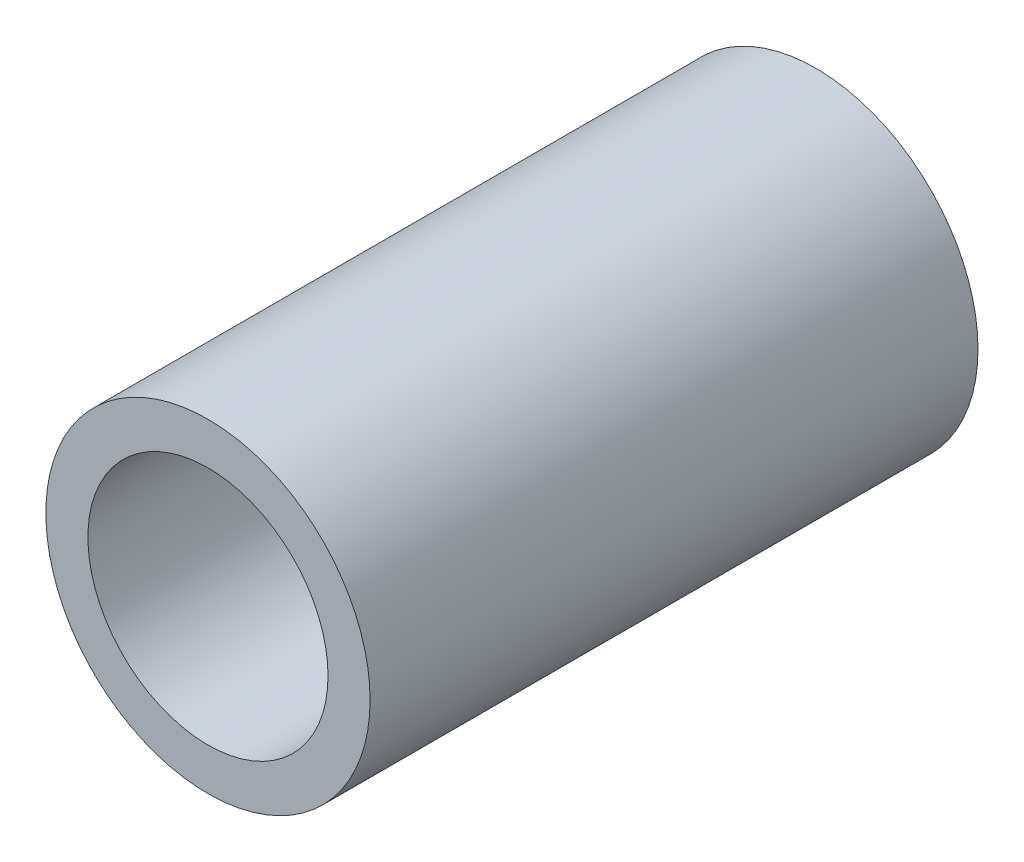
ISO-10303-21;
HEADER;
FILE_DESCRIPTION(('STEP AP214'),'2;1');
FILE_NAME('part.step','',(''),(''),'','','');
FILE_SCHEMA(('AUTOMOTIVE_DESIGN { 1 0 10303 214 1 1 1 1 }'));
ENDSEC;
DATA;
#1=APPLICATION_CONTEXT('core data for automotive mechanical design processes');
#2=APPLICATION_PROTOCOL_DEFINITION('international standard','automotive_design',2000,#1);
#3=PRODUCT_CONTEXT('',#1,'mechanical');
#4=PRODUCT('Part','Part','',(#3));
#5=PRODUCT_RELATED_PRODUCT_CATEGORY('part','',(#4));
#6=PRODUCT_DEFINITION_FORMATION('','',#4);
#7=PRODUCT_DEFINITION_CONTEXT('part definition',#1,'design');
#8=PRODUCT_DEFINITION('design','',#6,#7);
#9=PRODUCT_DEFINITION_SHAPE('','',#8);
#10=(LENGTH_UNIT() NAMED_UNIT(*) SI_UNIT(.MILLI.,.METRE.));
#11=(NAMED_UNIT(*) PLANE_ANGLE_UNIT() SI_UNIT($,.RADIAN.));
#12=(NAMED_UNIT(*) SI_UNIT($,.STERADIAN.) SOLID_ANGLE_UNIT());
#13=UNCERTAINTY_MEASURE_WITH_UNIT(LENGTH_MEASURE(1.E-05),#10,'distance_accuracy_value','');
#14=(GEOMETRIC_REPRESENTATION_CONTEXT(3) GLOBAL_UNCERTAINTY_ASSIGNED_CONTEXT((#13)) GLOBAL_UNIT_ASSIGNED_CONTEXT((#10,
#11,#12)) REPRESENTATION_CONTEXT('',''));
#15=CARTESIAN_POINT('',(0.,0.,0.));
#16=DIRECTION('',(0.,0.,1.));
#17=DIRECTION('',(1.,0.,0.));
#18=AXIS2_PLACEMENT_3D('',#15,#16,#17);
#19=CARTESIAN_POINT('',(0.,0.,20.));
#20=DIRECTION('',(0.,0.,1.));
#21=DIRECTION('',(1.,0.,0.));
#22=AXIS2_PLACEMENT_3D('',#19,#20,#21);
#23=PLANE('',#22);
#24=CARTESIAN_POINT('',(0.,0.,20.));
#25=DIRECTION('',(0.,0.,1.));
#26=DIRECTION('',(1.,0.,0.));
#27=AXIS2_PLACEMENT_3D('',#24,#25,#26);
#28=CIRCLE('',#27,10.668);
#29=CARTESIAN_POINT('',(10.668,0.,20.));
#30=VERTEX_POINT('',#29);
#31=EDGE_CURVE('E11',#30,#30,#28,.T.);
#32=ORIENTED_EDGE('',*,*,#31,.T.);
#33=EDGE_LOOP('',(#32));
#34=FACE_BOUND('',#33,.T.);
#35=CARTESIAN_POINT('',(0.,0.,20.));
#36=DIRECTION('',(0.,0.,1.));
#37=DIRECTION('',(1.,0.,0.));
#38=AXIS2_PLACEMENT_3D('',#35,#36,#37);
#39=CIRCLE('',#38,7.8994);
#40=CARTESIAN_POINT('',(7.8994,0.,20.));
#41=VERTEX_POINT('',#40);
#42=EDGE_CURVE('E56',#41,#41,#39,.T.);
#43=ORIENTED_EDGE('',*,*,#42,.F.);
#44=EDGE_LOOP('',(#43));
#45=FACE_BOUND('',#44,.T.);
#46=ADVANCED_FACE('F43',(#34,#45),#23,.T.);
#47=CARTESIAN_POINT('',(0.,0.,-20.));
#48=DIRECTION('',(0.,0.,1.));
#49=DIRECTION('',(1.,0.,0.));
#50=AXIS2_PLACEMENT_3D('',#47,#48,#49);
#51=PLANE('',#50);
#52=CARTESIAN_POINT('',(0.,0.,-20.));
#53=DIRECTION('',(0.,0.,1.));
#54=DIRECTION('',(1.,0.,0.));
#55=AXIS2_PLACEMENT_3D('',#52,#53,#54);
#56=CIRCLE('',#55,10.668);
#57=CARTESIAN_POINT('',(10.668,0.,-20.));
#58=VERTEX_POINT('',#57);
#59=EDGE_CURVE('E47',#58,#58,#56,.T.);
#60=ORIENTED_EDGE('',*,*,#59,.F.);
#61=EDGE_LOOP('',(#60));
#62=FACE_BOUND('',#61,.T.);
#63=CARTESIAN_POINT('',(0.,0.,-20.));
#64=DIRECTION('',(0.,0.,1.));
#65=DIRECTION('',(1.,0.,0.));
#66=AXIS2_PLACEMENT_3D('',#63,#64,#65);
#67=CIRCLE('',#66,7.8994);
#68=CARTESIAN_POINT('',(7.8994,0.,-20.));
#69=VERTEX_POINT('',#68);
#70=EDGE_CURVE('E58',#69,#69,#67,.T.);
#71=ORIENTED_EDGE('',*,*,#70,.T.);
#72=EDGE_LOOP('',(#71));
#73=FACE_BOUND('',#72,.T.);
#74=ADVANCED_FACE('F70',(#62,#73),#51,.F.);
#75=CARTESIAN_POINT('',(0.,0.,20.));
#76=DIRECTION('',(0.,0.,-1.));
#77=DIRECTION('',(-1.,0.,0.));
#78=AXIS2_PLACEMENT_3D('',#75,#76,#77);
#79=CYLINDRICAL_SURFACE('',#78,10.668);
#80=ORIENTED_EDGE('',*,*,#31,.F.);
#81=EDGE_LOOP('',(#80));
#82=FACE_BOUND('',#81,.T.);
#83=ORIENTED_EDGE('',*,*,#59,.T.);
#84=EDGE_LOOP('',(#83));
#85=FACE_BOUND('',#84,.T.);
#86=ADVANCED_FACE('F45',(#82,#85),#79,.T.);
#87=CARTESIAN_POINT('',(0.,0.,20.));
#88=DIRECTION('',(0.,0.,-1.));
#89=DIRECTION('',(-1.,0.,0.));
#90=AXIS2_PLACEMENT_3D('',#87,#88,#89);
#91=CYLINDRICAL_SURFACE('',#90,7.8994);
#92=ORIENTED_EDGE('',*,*,#42,.T.);
#93=EDGE_LOOP('',(#92));
#94=FACE_BOUND('',#93,.T.);
#95=ORIENTED_EDGE('',*,*,#70,.F.);
#96=EDGE_LOOP('',(#95));
#97=FACE_BOUND('',#96,.T.);
#98=ADVANCED_FACE('F66',(#94,#97),#91,.F.);
#99=CLOSED_SHELL('',(#46,#74,#86,#98));
#100=MANIFOLD_SOLID_BREP('B2',#99);
#101=ADVANCED_BREP_SHAPE_REPRESENTATION('',(#18,#100),#14);
#102=SHAPE_DEFINITION_REPRESENTATION(#9,#101);
ENDSEC;
END-ISO-10303-21;
